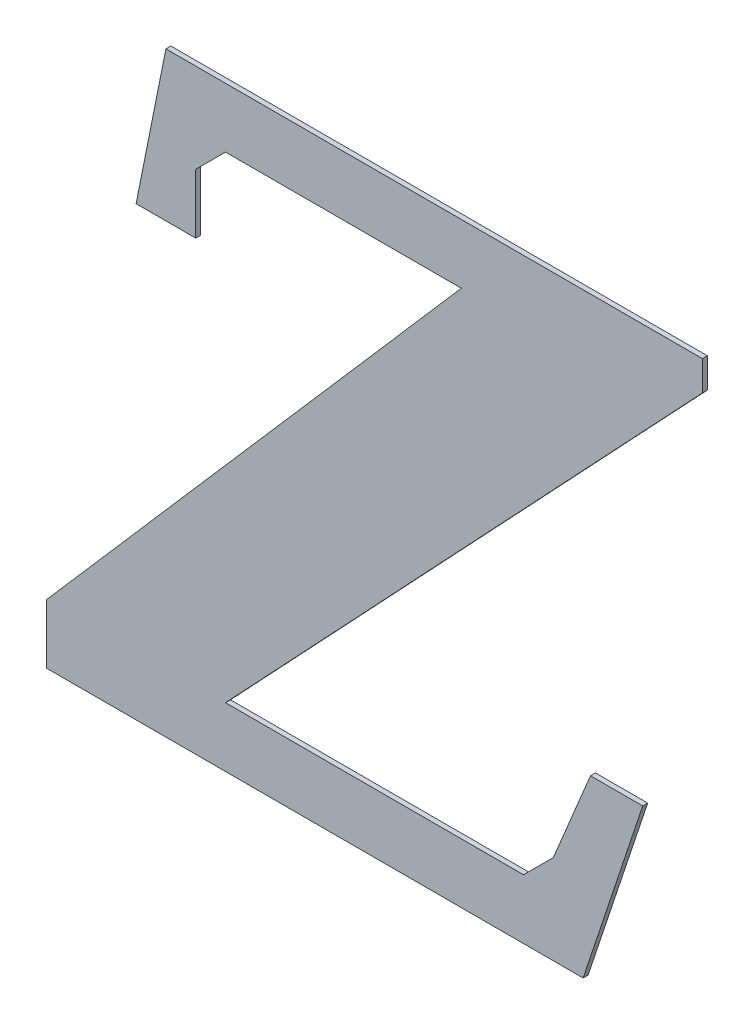
ISO-10303-21;
HEADER;
FILE_DESCRIPTION(('STEP AP214'),'2;1');
FILE_NAME('part.step','',(''),(''),'','','');
FILE_SCHEMA(('AUTOMOTIVE_DESIGN { 1 0 10303 214 1 1 1 1 }'));
ENDSEC;
DATA;
#1=APPLICATION_CONTEXT('core data for automotive mechanical design processes');
#2=APPLICATION_PROTOCOL_DEFINITION('international standard','automotive_design',2000,#1);
#3=PRODUCT_CONTEXT('',#1,'mechanical');
#4=PRODUCT('Part','Part','',(#3));
#5=PRODUCT_RELATED_PRODUCT_CATEGORY('part','',(#4));
#6=PRODUCT_DEFINITION_FORMATION('','',#4);
#7=PRODUCT_DEFINITION_CONTEXT('part definition',#1,'design');
#8=PRODUCT_DEFINITION('design','',#6,#7);
#9=PRODUCT_DEFINITION_SHAPE('','',#8);
#10=(LENGTH_UNIT() NAMED_UNIT(*) SI_UNIT(.MILLI.,.METRE.));
#11=(NAMED_UNIT(*) PLANE_ANGLE_UNIT() SI_UNIT($,.RADIAN.));
#12=(NAMED_UNIT(*) SI_UNIT($,.STERADIAN.) SOLID_ANGLE_UNIT());
#13=UNCERTAINTY_MEASURE_WITH_UNIT(LENGTH_MEASURE(1.E-05),#10,'distance_accuracy_value','');
#14=(GEOMETRIC_REPRESENTATION_CONTEXT(3) GLOBAL_UNCERTAINTY_ASSIGNED_CONTEXT((#13)) GLOBAL_UNIT_ASSIGNED_CONTEXT((#10,
#11,#12)) REPRESENTATION_CONTEXT('',''));
#15=CARTESIAN_POINT('',(0.,0.,0.));
#16=DIRECTION('',(0.,0.,1.));
#17=DIRECTION('',(1.,0.,0.));
#18=AXIS2_PLACEMENT_3D('',#15,#16,#17);
#19=CARTESIAN_POINT('',(-0.47999904,0.2999994,0.01));
#20=DIRECTION('',(0.,0.,1.));
#21=DIRECTION('',(1.,0.,0.));
#22=AXIS2_PLACEMENT_3D('',#19,#20,#21);
#23=PLANE('',#22);
#24=DIRECTION('',(1.,0.,0.));
#25=VECTOR('',#24,1.);
#26=CARTESIAN_POINT('',(-0.41999916,0.60000134,0.01));
#27=LINE('',#26,#25);
#28=CARTESIAN_POINT('',(-0.419999160000019,0.600001340000004,0.01));
#29=VERTEX_POINT('',#28);
#30=CARTESIAN_POINT('',(0.66000122,0.60000134,0.01));
#31=VERTEX_POINT('',#30);
#32=EDGE_CURVE('E198',#29,#31,#27,.T.);
#33=ORIENTED_EDGE('',*,*,#32,.F.);
#34=DIRECTION('',(-0.196114538561244,-0.980580995004956,0.));
#35=VECTOR('',#34,1.);
#36=CARTESIAN_POINT('',(-0.41999916,0.60000134,0.01));
#37=LINE('',#36,#35);
#38=CARTESIAN_POINT('',(-0.47999904,0.2999994,0.01));
#39=VERTEX_POINT('',#38);
#40=EDGE_CURVE('E20',#29,#39,#37,.T.);
#41=ORIENTED_EDGE('',*,*,#40,.T.);
#42=DIRECTION('',(1.,0.,0.));
#43=VECTOR('',#42,1.);
#44=CARTESIAN_POINT('',(-0.35999928,0.2999994,0.01));
#45=LINE('',#44,#43);
#46=CARTESIAN_POINT('',(-0.35999928,0.2999994,0.01));
#47=VERTEX_POINT('',#46);
#48=EDGE_CURVE('E140',#47,#39,#45,.F.);
#49=ORIENTED_EDGE('',*,*,#48,.F.);
#50=DIRECTION('',(0.,1.,0.));
#51=VECTOR('',#50,1.);
#52=CARTESIAN_POINT('',(-0.35999928,0.41999916,0.01));
#53=LINE('',#52,#51);
#54=CARTESIAN_POINT('',(-0.359999280000011,0.419999160000011,0.01));
#55=VERTEX_POINT('',#54);
#56=EDGE_CURVE('E131',#55,#47,#53,.F.);
#57=ORIENTED_EDGE('',*,*,#56,.F.);
#58=DIRECTION('',(0.707106781187048,0.707106781186048,0.));
#59=VECTOR('',#58,1.);
#60=CARTESIAN_POINT('',(-0.2999994,0.47999904,0.01));
#61=LINE('',#60,#59);
#62=CARTESIAN_POINT('',(-0.2999994,0.47999904,0.01));
#63=VERTEX_POINT('',#62);
#64=EDGE_CURVE('E126',#63,#55,#61,.F.);
#65=ORIENTED_EDGE('',*,*,#64,.F.);
#66=DIRECTION('',(1.,0.,0.));
#67=VECTOR('',#66,1.);
#68=CARTESIAN_POINT('',(0.17482312,0.47999904,0.01));
#69=LINE('',#68,#67);
#70=CARTESIAN_POINT('',(0.174823120000096,0.479999039999917,0.01));
#71=VERTEX_POINT('',#70);
#72=EDGE_CURVE('E154',#71,#63,#69,.F.);
#73=ORIENTED_EDGE('',*,*,#72,.F.);
#74=DIRECTION('',(-0.656196015054873,-0.754590478223854,0.));
#75=VECTOR('',#74,1.);
#76=CARTESIAN_POINT('',(-0.65999868,-0.48000158,0.01));
#77=LINE('',#76,#75);
#78=CARTESIAN_POINT('',(-0.65999868,-0.48000158,0.01));
#79=VERTEX_POINT('',#78);
#80=EDGE_CURVE('E158',#79,#71,#77,.F.);
#81=ORIENTED_EDGE('',*,*,#80,.F.);
#82=DIRECTION('',(0.,1.,0.));
#83=VECTOR('',#82,1.);
#84=CARTESIAN_POINT('',(-0.65999868,-0.60000134,0.01));
#85=LINE('',#84,#83);
#86=CARTESIAN_POINT('',(-0.65999868,-0.60000134,0.01));
#87=VERTEX_POINT('',#86);
#88=EDGE_CURVE('E162',#87,#79,#85,.T.);
#89=ORIENTED_EDGE('',*,*,#88,.F.);
#90=DIRECTION('',(1.,0.,0.));
#91=VECTOR('',#90,1.);
#92=CARTESIAN_POINT('',(0.4200017,-0.60000134,0.01));
#93=LINE('',#92,#91);
#94=CARTESIAN_POINT('',(0.420001699999955,-0.600001339999985,0.01));
#95=VERTEX_POINT('',#94);
#96=EDGE_CURVE('E166',#95,#87,#93,.F.);
#97=ORIENTED_EDGE('',*,*,#96,.F.);
#98=DIRECTION('',(0.31622575797903,0.948683967394089,0.));
#99=VECTOR('',#98,1.);
#100=CARTESIAN_POINT('',(0.54000146,-0.23999952,0.01));
#101=LINE('',#100,#99);
#102=CARTESIAN_POINT('',(0.54000146,-0.23999952,0.01));
#103=VERTEX_POINT('',#102);
#104=EDGE_CURVE('E170',#103,#95,#101,.F.);
#105=ORIENTED_EDGE('',*,*,#104,.F.);
#106=DIRECTION('',(1.,0.,0.));
#107=VECTOR('',#106,1.);
#108=CARTESIAN_POINT('',(0.4348226,-0.23999952,0.01));
#109=LINE('',#108,#107);
#110=CARTESIAN_POINT('',(0.434822600000026,-0.239999520000011,0.01));
#111=VERTEX_POINT('',#110);
#112=EDGE_CURVE('E174',#111,#103,#109,.T.);
#113=ORIENTED_EDGE('',*,*,#112,.F.);
#114=DIRECTION('',(-0.383827886941067,-0.923404653013161,0.));
#115=VECTOR('',#114,1.);
#116=CARTESIAN_POINT('',(0.36000182,-0.4200017,0.01));
#117=LINE('',#116,#115);
#118=CARTESIAN_POINT('',(0.360001820000011,-0.420001700000011,0.01));
#119=VERTEX_POINT('',#118);
#120=EDGE_CURVE('E178',#119,#111,#117,.F.);
#121=ORIENTED_EDGE('',*,*,#120,.F.);
#122=DIRECTION('',(-0.707106781187048,-0.707106781186048,0.));
#123=VECTOR('',#122,1.);
#124=CARTESIAN_POINT('',(0.30000194,-0.48000158,0.01));
#125=LINE('',#124,#123);
#126=CARTESIAN_POINT('',(0.30000194,-0.48000158,0.01));
#127=VERTEX_POINT('',#126);
#128=EDGE_CURVE('E182',#127,#119,#125,.F.);
#129=ORIENTED_EDGE('',*,*,#128,.F.);
#130=DIRECTION('',(1.,0.,0.));
#131=VECTOR('',#130,1.);
#132=CARTESIAN_POINT('',(-0.2999994,-0.48000158,0.01));
#133=LINE('',#132,#131);
#134=CARTESIAN_POINT('',(-0.299999400000014,-0.480001579999987,0.01));
#135=VERTEX_POINT('',#134);
#136=EDGE_CURVE('E186',#135,#127,#133,.T.);
#137=ORIENTED_EDGE('',*,*,#136,.F.);
#138=DIRECTION('',(0.685364755568543,0.728199939456514,0.));
#139=VECTOR('',#138,1.);
#140=CARTESIAN_POINT('',(0.66000122,0.53999892,0.01));
#141=LINE('',#140,#139);
#142=CARTESIAN_POINT('',(0.66000122,0.53999892,0.01));
#143=VERTEX_POINT('',#142);
#144=EDGE_CURVE('E190',#143,#135,#141,.F.);
#145=ORIENTED_EDGE('',*,*,#144,.F.);
#146=DIRECTION('',(0.,1.,0.));
#147=VECTOR('',#146,1.);
#148=CARTESIAN_POINT('',(0.66000122,0.60000134,0.01));
#149=LINE('',#148,#147);
#150=EDGE_CURVE('E194',#31,#143,#149,.F.);
#151=ORIENTED_EDGE('',*,*,#150,.F.);
#152=EDGE_LOOP('',(#33,#41,#49,#57,#65,#73,#81,#89,#97,#105,#113,#121,#129,#137,#145,#151));
#153=FACE_BOUND('',#152,.T.);
#154=ADVANCED_FACE('F17',(#153),#23,.T.);
#155=CARTESIAN_POINT('',(-0.35999928,0.2999994,0.));
#156=DIRECTION('',(0.,-1.,0.));
#157=DIRECTION('',(0.,0.,-1.));
#158=AXIS2_PLACEMENT_3D('',#155,#156,#157);
#159=PLANE('',#158);
#160=DIRECTION('',(0.,0.,1.));
#161=VECTOR('',#160,1.);
#162=CARTESIAN_POINT('',(-0.47999904,0.2999994,0.));
#163=LINE('',#162,#161);
#164=CARTESIAN_POINT('',(-0.47999904,0.2999994,0.));
#165=VERTEX_POINT('',#164);
#166=EDGE_CURVE('E202',#165,#39,#163,.T.);
#167=ORIENTED_EDGE('',*,*,#166,.F.);
#168=DIRECTION('',(1.,0.,0.));
#169=VECTOR('',#168,1.);
#170=CARTESIAN_POINT('',(-0.47999904,0.2999994,0.));
#171=LINE('',#170,#169);
#172=CARTESIAN_POINT('',(-0.35999928,0.2999994,0.));
#173=VERTEX_POINT('',#172);
#174=EDGE_CURVE('E149',#165,#173,#171,.T.);
#175=ORIENTED_EDGE('',*,*,#174,.T.);
#176=DIRECTION('',(0.,0.,-1.));
#177=VECTOR('',#176,1.);
#178=CARTESIAN_POINT('',(-0.35999928,0.2999994,0.));
#179=LINE('',#178,#177);
#180=EDGE_CURVE('E136',#47,#173,#179,.T.);
#181=ORIENTED_EDGE('',*,*,#180,.F.);
#182=ORIENTED_EDGE('',*,*,#48,.T.);
#183=EDGE_LOOP('',(#167,#175,#181,#182));
#184=FACE_BOUND('',#183,.T.);
#185=ADVANCED_FACE('F148',(#184),#159,.T.);
#186=CARTESIAN_POINT('',(-0.35999928,0.41999916,0.));
#187=DIRECTION('',(1.,0.,0.));
#188=DIRECTION('',(0.,0.,-1.));
#189=AXIS2_PLACEMENT_3D('',#186,#187,#188);
#190=PLANE('',#189);
#191=ORIENTED_EDGE('',*,*,#180,.T.);
#192=DIRECTION('',(0.,1.,0.));
#193=VECTOR('',#192,1.);
#194=CARTESIAN_POINT('',(-0.35999928,0.2999994,0.));
#195=LINE('',#194,#193);
#196=CARTESIAN_POINT('',(-0.359999280000011,0.419999160000011,0.));
#197=VERTEX_POINT('',#196);
#198=EDGE_CURVE('E206',#173,#197,#195,.T.);
#199=ORIENTED_EDGE('',*,*,#198,.T.);
#200=DIRECTION('',(0.,0.,1.));
#201=VECTOR('',#200,1.);
#202=CARTESIAN_POINT('',(-0.359999280000042,0.419999160000042,0.));
#203=LINE('',#202,#201);
#204=EDGE_CURVE('E138',#55,#197,#203,.F.);
#205=ORIENTED_EDGE('',*,*,#204,.F.);
#206=ORIENTED_EDGE('',*,*,#56,.T.);
#207=EDGE_LOOP('',(#191,#199,#205,#206));
#208=FACE_BOUND('',#207,.T.);
#209=ADVANCED_FACE('F133',(#208),#190,.T.);
#210=CARTESIAN_POINT('',(-0.2999994,0.47999904,0.));
#211=DIRECTION('',(0.707106781186048,-0.707106781187048,0.));
#212=DIRECTION('',(0.707106781187048,0.707106781186048,0.));
#213=AXIS2_PLACEMENT_3D('',#210,#211,#212);
#214=PLANE('',#213);
#215=ORIENTED_EDGE('',*,*,#204,.T.);
#216=DIRECTION('',(0.707106781186547,0.707106781186548,0.));
#217=VECTOR('',#216,1.);
#218=CARTESIAN_POINT('',(-0.35999928,0.41999916,0.));
#219=LINE('',#218,#217);
#220=CARTESIAN_POINT('',(-0.2999994,0.47999904,0.));
#221=VERTEX_POINT('',#220);
#222=EDGE_CURVE('E208',#197,#221,#219,.T.);
#223=ORIENTED_EDGE('',*,*,#222,.T.);
#224=DIRECTION('',(0.,0.,-1.));
#225=VECTOR('',#224,1.);
#226=CARTESIAN_POINT('',(-0.2999994,0.47999904,0.));
#227=LINE('',#226,#225);
#228=EDGE_CURVE('E156',#63,#221,#227,.T.);
#229=ORIENTED_EDGE('',*,*,#228,.F.);
#230=ORIENTED_EDGE('',*,*,#64,.T.);
#231=EDGE_LOOP('',(#215,#223,#229,#230));
#232=FACE_BOUND('',#231,.T.);
#233=ADVANCED_FACE('F306',(#232),#214,.T.);
#234=CARTESIAN_POINT('',(0.17482312,0.47999904,0.));
#235=DIRECTION('',(0.,-1.,0.));
#236=DIRECTION('',(0.,0.,-1.));
#237=AXIS2_PLACEMENT_3D('',#234,#235,#236);
#238=PLANE('',#237);
#239=ORIENTED_EDGE('',*,*,#228,.T.);
#240=DIRECTION('',(1.,0.,0.));
#241=VECTOR('',#240,1.);
#242=CARTESIAN_POINT('',(-0.47999904,0.47999904,0.));
#243=LINE('',#242,#241);
#244=CARTESIAN_POINT('',(0.174823120000096,0.479999039999917,0.));
#245=VERTEX_POINT('',#244);
#246=EDGE_CURVE('E211',#221,#245,#243,.T.);
#247=ORIENTED_EDGE('',*,*,#246,.T.);
#248=DIRECTION('',(0.,0.,1.));
#249=VECTOR('',#248,1.);
#250=CARTESIAN_POINT('',(0.174823120000384,0.479999039999666,0.));
#251=LINE('',#250,#249);
#252=EDGE_CURVE('E160',#71,#245,#251,.F.);
#253=ORIENTED_EDGE('',*,*,#252,.F.);
#254=ORIENTED_EDGE('',*,*,#72,.T.);
#255=EDGE_LOOP('',(#239,#247,#253,#254));
#256=FACE_BOUND('',#255,.T.);
#257=ADVANCED_FACE('F305',(#256),#238,.T.);
#258=CARTESIAN_POINT('',(-0.65999868,-0.48000158,0.));
#259=DIRECTION('',(-0.754590478223854,0.656196015054873,0.));
#260=DIRECTION('',(-0.656196015054873,-0.754590478223854,0.));
#261=AXIS2_PLACEMENT_3D('',#258,#259,#260);
#262=PLANE('',#261);
#263=ORIENTED_EDGE('',*,*,#252,.T.);
#264=DIRECTION('',(-0.656196015054571,-0.754590478224117,0.));
#265=VECTOR('',#264,1.);
#266=CARTESIAN_POINT('',(0.17482312,0.47999904,0.));
#267=LINE('',#266,#265);
#268=CARTESIAN_POINT('',(-0.65999868,-0.48000158,0.));
#269=VERTEX_POINT('',#268);
#270=EDGE_CURVE('E214',#245,#269,#267,.T.);
#271=ORIENTED_EDGE('',*,*,#270,.T.);
#272=DIRECTION('',(0.,0.,1.));
#273=VECTOR('',#272,1.);
#274=CARTESIAN_POINT('',(-0.65999868,-0.48000158,0.));
#275=LINE('',#274,#273);
#276=EDGE_CURVE('E164',#79,#269,#275,.F.);
#277=ORIENTED_EDGE('',*,*,#276,.F.);
#278=ORIENTED_EDGE('',*,*,#80,.T.);
#279=EDGE_LOOP('',(#263,#271,#277,#278));
#280=FACE_BOUND('',#279,.T.);
#281=ADVANCED_FACE('F299',(#280),#262,.T.);
#282=CARTESIAN_POINT('',(-0.65999868,-0.60000134,0.));
#283=DIRECTION('',(-1.,0.,0.));
#284=DIRECTION('',(0.,0.,1.));
#285=AXIS2_PLACEMENT_3D('',#282,#283,#284);
#286=PLANE('',#285);
#287=ORIENTED_EDGE('',*,*,#276,.T.);
#288=DIRECTION('',(0.,1.,0.));
#289=VECTOR('',#288,1.);
#290=CARTESIAN_POINT('',(-0.65999868,0.2999994,0.));
#291=LINE('',#290,#289);
#292=CARTESIAN_POINT('',(-0.65999868,-0.60000134,0.));
#293=VERTEX_POINT('',#292);
#294=EDGE_CURVE('E217',#269,#293,#291,.F.);
#295=ORIENTED_EDGE('',*,*,#294,.T.);
#296=DIRECTION('',(0.,0.,-1.));
#297=VECTOR('',#296,1.);
#298=CARTESIAN_POINT('',(-0.65999868,-0.60000134,0.));
#299=LINE('',#298,#297);
#300=EDGE_CURVE('E168',#87,#293,#299,.T.);
#301=ORIENTED_EDGE('',*,*,#300,.F.);
#302=ORIENTED_EDGE('',*,*,#88,.T.);
#303=EDGE_LOOP('',(#287,#295,#301,#302));
#304=FACE_BOUND('',#303,.T.);
#305=ADVANCED_FACE('F295',(#304),#286,.T.);
#306=CARTESIAN_POINT('',(0.4200017,-0.60000134,0.));
#307=DIRECTION('',(0.,-1.,0.));
#308=DIRECTION('',(0.,0.,-1.));
#309=AXIS2_PLACEMENT_3D('',#306,#307,#308);
#310=PLANE('',#309);
#311=ORIENTED_EDGE('',*,*,#300,.T.);
#312=DIRECTION('',(1.,0.,0.));
#313=VECTOR('',#312,1.);
#314=CARTESIAN_POINT('',(-0.47999904,-0.60000134,0.));
#315=LINE('',#314,#313);
#316=CARTESIAN_POINT('',(0.420001699999955,-0.600001339999985,0.));
#317=VERTEX_POINT('',#316);
#318=EDGE_CURVE('E220',#293,#317,#315,.T.);
#319=ORIENTED_EDGE('',*,*,#318,.T.);
#320=DIRECTION('',(0.,0.,1.));
#321=VECTOR('',#320,1.);
#322=CARTESIAN_POINT('',(0.420001699999818,-0.600001339999939,0.));
#323=LINE('',#322,#321);
#324=EDGE_CURVE('E172',#95,#317,#323,.F.);
#325=ORIENTED_EDGE('',*,*,#324,.F.);
#326=ORIENTED_EDGE('',*,*,#96,.T.);
#327=EDGE_LOOP('',(#311,#319,#325,#326));
#328=FACE_BOUND('',#327,.T.);
#329=ADVANCED_FACE('F289',(#328),#310,.T.);
#330=CARTESIAN_POINT('',(0.54000146,-0.23999952,0.));
#331=DIRECTION('',(0.948683967394089,-0.31622575797903,0.));
#332=DIRECTION('',(0.31622575797903,0.948683967394089,0.));
#333=AXIS2_PLACEMENT_3D('',#330,#331,#332);
#334=PLANE('',#333);
#335=ORIENTED_EDGE('',*,*,#324,.T.);
#336=DIRECTION('',(0.31622575797855,0.948683967394248,0.));
#337=VECTOR('',#336,1.);
#338=CARTESIAN_POINT('',(0.4200017,-0.60000134,0.));
#339=LINE('',#338,#337);
#340=CARTESIAN_POINT('',(0.54000146,-0.23999952,0.));
#341=VERTEX_POINT('',#340);
#342=EDGE_CURVE('E223',#317,#341,#339,.T.);
#343=ORIENTED_EDGE('',*,*,#342,.T.);
#344=DIRECTION('',(0.,0.,1.));
#345=VECTOR('',#344,1.);
#346=CARTESIAN_POINT('',(0.54000146,-0.23999952,0.));
#347=LINE('',#346,#345);
#348=EDGE_CURVE('E176',#103,#341,#347,.F.);
#349=ORIENTED_EDGE('',*,*,#348,.F.);
#350=ORIENTED_EDGE('',*,*,#104,.T.);
#351=EDGE_LOOP('',(#335,#343,#349,#350));
#352=FACE_BOUND('',#351,.T.);
#353=ADVANCED_FACE('F285',(#352),#334,.T.);
#354=CARTESIAN_POINT('',(0.4348226,-0.23999952,0.));
#355=DIRECTION('',(0.,1.,0.));
#356=DIRECTION('',(0.,0.,1.));
#357=AXIS2_PLACEMENT_3D('',#354,#355,#356);
#358=PLANE('',#357);
#359=ORIENTED_EDGE('',*,*,#348,.T.);
#360=DIRECTION('',(1.,0.,0.));
#361=VECTOR('',#360,1.);
#362=CARTESIAN_POINT('',(-0.47999904,-0.23999952,0.));
#363=LINE('',#362,#361);
#364=CARTESIAN_POINT('',(0.434822600000026,-0.239999520000011,0.));
#365=VERTEX_POINT('',#364);
#366=EDGE_CURVE('E226',#341,#365,#363,.F.);
#367=ORIENTED_EDGE('',*,*,#366,.T.);
#368=DIRECTION('',(0.,0.,1.));
#369=VECTOR('',#368,1.);
#370=CARTESIAN_POINT('',(0.434822600000103,-0.239999520000043,0.));
#371=LINE('',#370,#369);
#372=EDGE_CURVE('E180',#111,#365,#371,.F.);
#373=ORIENTED_EDGE('',*,*,#372,.F.);
#374=ORIENTED_EDGE('',*,*,#112,.T.);
#375=EDGE_LOOP('',(#359,#367,#373,#374));
#376=FACE_BOUND('',#375,.T.);
#377=ADVANCED_FACE('F279',(#376),#358,.T.);
#378=CARTESIAN_POINT('',(0.36000182,-0.4200017,0.));
#379=DIRECTION('',(-0.923404653013161,0.383827886941067,0.));
#380=DIRECTION('',(-0.383827886941067,-0.923404653013161,0.));
#381=AXIS2_PLACEMENT_3D('',#378,#379,#380);
#382=PLANE('',#381);
#383=ORIENTED_EDGE('',*,*,#372,.T.);
#384=DIRECTION('',(-0.383827886940538,-0.92340465301338,0.));
#385=VECTOR('',#384,1.);
#386=CARTESIAN_POINT('',(0.4348226,-0.23999952,0.));
#387=LINE('',#386,#385);
#388=CARTESIAN_POINT('',(0.360001820000011,-0.420001700000011,0.));
#389=VERTEX_POINT('',#388);
#390=EDGE_CURVE('E229',#365,#389,#387,.T.);
#391=ORIENTED_EDGE('',*,*,#390,.T.);
#392=DIRECTION('',(0.,0.,1.));
#393=VECTOR('',#392,1.);
#394=CARTESIAN_POINT('',(0.360001820000042,-0.420001700000042,0.));
#395=LINE('',#394,#393);
#396=EDGE_CURVE('E184',#119,#389,#395,.F.);
#397=ORIENTED_EDGE('',*,*,#396,.F.);
#398=ORIENTED_EDGE('',*,*,#120,.T.);
#399=EDGE_LOOP('',(#383,#391,#397,#398));
#400=FACE_BOUND('',#399,.T.);
#401=ADVANCED_FACE('F275',(#400),#382,.T.);
#402=CARTESIAN_POINT('',(0.30000194,-0.48000158,0.));
#403=DIRECTION('',(-0.707106781186048,0.707106781187048,0.));
#404=DIRECTION('',(-0.707106781187048,-0.707106781186048,0.));
#405=AXIS2_PLACEMENT_3D('',#402,#403,#404);
#406=PLANE('',#405);
#407=ORIENTED_EDGE('',*,*,#396,.T.);
#408=DIRECTION('',(-0.707106781186547,-0.707106781186548,0.));
#409=VECTOR('',#408,1.);
#410=CARTESIAN_POINT('',(0.36000182,-0.4200017,0.));
#411=LINE('',#410,#409);
#412=CARTESIAN_POINT('',(0.30000194,-0.48000158,0.));
#413=VERTEX_POINT('',#412);
#414=EDGE_CURVE('E232',#389,#413,#411,.T.);
#415=ORIENTED_EDGE('',*,*,#414,.T.);
#416=DIRECTION('',(0.,0.,1.));
#417=VECTOR('',#416,1.);
#418=CARTESIAN_POINT('',(0.30000194,-0.48000158,0.));
#419=LINE('',#418,#417);
#420=EDGE_CURVE('E188',#127,#413,#419,.F.);
#421=ORIENTED_EDGE('',*,*,#420,.F.);
#422=ORIENTED_EDGE('',*,*,#128,.T.);
#423=EDGE_LOOP('',(#407,#415,#421,#422));
#424=FACE_BOUND('',#423,.T.);
#425=ADVANCED_FACE('F269',(#424),#406,.T.);
#426=CARTESIAN_POINT('',(-0.2999994,-0.48000158,0.));
#427=DIRECTION('',(0.,1.,0.));
#428=DIRECTION('',(0.,0.,1.));
#429=AXIS2_PLACEMENT_3D('',#426,#427,#428);
#430=PLANE('',#429);
#431=ORIENTED_EDGE('',*,*,#420,.T.);
#432=DIRECTION('',(1.,0.,0.));
#433=VECTOR('',#432,1.);
#434=CARTESIAN_POINT('',(-0.47999904,-0.48000158,0.));
#435=LINE('',#434,#433);
#436=CARTESIAN_POINT('',(-0.299999400000014,-0.480001579999987,0.));
#437=VERTEX_POINT('',#436);
#438=EDGE_CURVE('E235',#413,#437,#435,.F.);
#439=ORIENTED_EDGE('',*,*,#438,.T.);
#440=DIRECTION('',(0.,0.,1.));
#441=VECTOR('',#440,1.);
#442=CARTESIAN_POINT('',(-0.299999400000055,-0.480001579999948,0.));
#443=LINE('',#442,#441);
#444=EDGE_CURVE('E192',#135,#437,#443,.F.);
#445=ORIENTED_EDGE('',*,*,#444,.F.);
#446=ORIENTED_EDGE('',*,*,#136,.T.);
#447=EDGE_LOOP('',(#431,#439,#445,#446));
#448=FACE_BOUND('',#447,.T.);
#449=ADVANCED_FACE('F265',(#448),#430,.T.);
#450=CARTESIAN_POINT('',(0.66000122,0.53999892,0.));
#451=DIRECTION('',(0.728199939456514,-0.685364755568543,0.));
#452=DIRECTION('',(0.685364755568543,0.728199939456514,0.));
#453=AXIS2_PLACEMENT_3D('',#450,#451,#452);
#454=PLANE('',#453);
#455=ORIENTED_EDGE('',*,*,#444,.T.);
#456=DIRECTION('',(0.685364755568504,0.728199939456551,0.));
#457=VECTOR('',#456,1.);
#458=CARTESIAN_POINT('',(-0.2999994,-0.48000158,0.));
#459=LINE('',#458,#457);
#460=CARTESIAN_POINT('',(0.66000122,0.53999892,0.));
#461=VERTEX_POINT('',#460);
#462=EDGE_CURVE('E238',#437,#461,#459,.T.);
#463=ORIENTED_EDGE('',*,*,#462,.T.);
#464=DIRECTION('',(0.,0.,-1.));
#465=VECTOR('',#464,1.);
#466=CARTESIAN_POINT('',(0.66000122,0.53999892,0.));
#467=LINE('',#466,#465);
#468=EDGE_CURVE('E196',#143,#461,#467,.T.);
#469=ORIENTED_EDGE('',*,*,#468,.F.);
#470=ORIENTED_EDGE('',*,*,#144,.T.);
#471=EDGE_LOOP('',(#455,#463,#469,#470));
#472=FACE_BOUND('',#471,.T.);
#473=ADVANCED_FACE('F259',(#472),#454,.T.);
#474=CARTESIAN_POINT('',(0.66000122,0.60000134,0.));
#475=DIRECTION('',(1.,0.,0.));
#476=DIRECTION('',(0.,0.,-1.));
#477=AXIS2_PLACEMENT_3D('',#474,#475,#476);
#478=PLANE('',#477);
#479=ORIENTED_EDGE('',*,*,#468,.T.);
#480=DIRECTION('',(0.,1.,0.));
#481=VECTOR('',#480,1.);
#482=CARTESIAN_POINT('',(0.66000122,0.2999994,0.));
#483=LINE('',#482,#481);
#484=CARTESIAN_POINT('',(0.66000122,0.60000134,0.));
#485=VERTEX_POINT('',#484);
#486=EDGE_CURVE('E241',#461,#485,#483,.T.);
#487=ORIENTED_EDGE('',*,*,#486,.T.);
#488=DIRECTION('',(0.,0.,1.));
#489=VECTOR('',#488,1.);
#490=CARTESIAN_POINT('',(0.66000122,0.60000134,0.));
#491=LINE('',#490,#489);
#492=EDGE_CURVE('E200',#31,#485,#491,.F.);
#493=ORIENTED_EDGE('',*,*,#492,.F.);
#494=ORIENTED_EDGE('',*,*,#150,.T.);
#495=EDGE_LOOP('',(#479,#487,#493,#494));
#496=FACE_BOUND('',#495,.T.);
#497=ADVANCED_FACE('F254',(#496),#478,.T.);
#498=CARTESIAN_POINT('',(-0.41999916,0.60000134,0.));
#499=DIRECTION('',(0.,1.,0.));
#500=DIRECTION('',(0.,0.,1.));
#501=AXIS2_PLACEMENT_3D('',#498,#499,#500);
#502=PLANE('',#501);
#503=ORIENTED_EDGE('',*,*,#492,.T.);
#504=DIRECTION('',(1.,0.,0.));
#505=VECTOR('',#504,1.);
#506=CARTESIAN_POINT('',(-0.47999904,0.60000134,0.));
#507=LINE('',#506,#505);
#508=CARTESIAN_POINT('',(-0.419999160000019,0.600001340000004,0.));
#509=VERTEX_POINT('',#508);
#510=EDGE_CURVE('E26',#485,#509,#507,.F.);
#511=ORIENTED_EDGE('',*,*,#510,.T.);
#512=DIRECTION('',(0.,0.,1.));
#513=VECTOR('',#512,1.);
#514=CARTESIAN_POINT('',(-0.419999160000074,0.600001340000015,0.));
#515=LINE('',#514,#513);
#516=EDGE_CURVE('E34',#29,#509,#515,.F.);
#517=ORIENTED_EDGE('',*,*,#516,.F.);
#518=ORIENTED_EDGE('',*,*,#32,.T.);
#519=EDGE_LOOP('',(#503,#511,#517,#518));
#520=FACE_BOUND('',#519,.T.);
#521=ADVANCED_FACE('F247',(#520),#502,.T.);
#522=CARTESIAN_POINT('',(-0.47999904,0.2999994,0.));
#523=DIRECTION('',(-0.980580995005005,0.196114538561001,0.));
#524=DIRECTION('',(-0.196114538561001,-0.980580995005005,0.));
#525=AXIS2_PLACEMENT_3D('',#522,#523,#524);
#526=PLANE('',#525);
#527=ORIENTED_EDGE('',*,*,#516,.T.);
#528=DIRECTION('',(-0.196114538561244,-0.980580995004956,0.));
#529=VECTOR('',#528,1.);
#530=CARTESIAN_POINT('',(-0.41999916,0.60000134,0.));
#531=LINE('',#530,#529);
#532=EDGE_CURVE('E11',#509,#165,#531,.T.);
#533=ORIENTED_EDGE('',*,*,#532,.T.);
#534=ORIENTED_EDGE('',*,*,#166,.T.);
#535=ORIENTED_EDGE('',*,*,#40,.F.);
#536=EDGE_LOOP('',(#527,#533,#534,#535));
#537=FACE_BOUND('',#536,.T.);
#538=ADVANCED_FACE('F307',(#537),#526,.T.);
#539=CARTESIAN_POINT('',(-0.47999904,0.2999994,0.));
#540=DIRECTION('',(0.,0.,1.));
#541=DIRECTION('',(1.,0.,0.));
#542=AXIS2_PLACEMENT_3D('',#539,#540,#541);
#543=PLANE('',#542);
#544=ORIENTED_EDGE('',*,*,#510,.F.);
#545=ORIENTED_EDGE('',*,*,#486,.F.);
#546=ORIENTED_EDGE('',*,*,#462,.F.);
#547=ORIENTED_EDGE('',*,*,#438,.F.);
#548=ORIENTED_EDGE('',*,*,#414,.F.);
#549=ORIENTED_EDGE('',*,*,#390,.F.);
#550=ORIENTED_EDGE('',*,*,#366,.F.);
#551=ORIENTED_EDGE('',*,*,#342,.F.);
#552=ORIENTED_EDGE('',*,*,#318,.F.);
#553=ORIENTED_EDGE('',*,*,#294,.F.);
#554=ORIENTED_EDGE('',*,*,#270,.F.);
#555=ORIENTED_EDGE('',*,*,#246,.F.);
#556=ORIENTED_EDGE('',*,*,#222,.F.);
#557=ORIENTED_EDGE('',*,*,#198,.F.);
#558=ORIENTED_EDGE('',*,*,#174,.F.);
#559=ORIENTED_EDGE('',*,*,#532,.F.);
#560=EDGE_LOOP('',(#544,#545,#546,#547,#548,#549,#550,#551,#552,#553,#554,#555,#556,#557,#558,#559));
#561=FACE_BOUND('',#560,.T.);
#562=ADVANCED_FACE('F251',(#561),#543,.F.);
#563=CLOSED_SHELL('',(#154,#185,#209,#233,#257,#281,#305,#329,#353,#377,#401,#425,#449,#473,
#497,#521,#538,#562));
#564=MANIFOLD_SOLID_BREP('B1',#563);
#565=ADVANCED_BREP_SHAPE_REPRESENTATION('',(#18,#564),#14);
#566=SHAPE_DEFINITION_REPRESENTATION(#9,#565);
ENDSEC;
END-ISO-10303-21;
